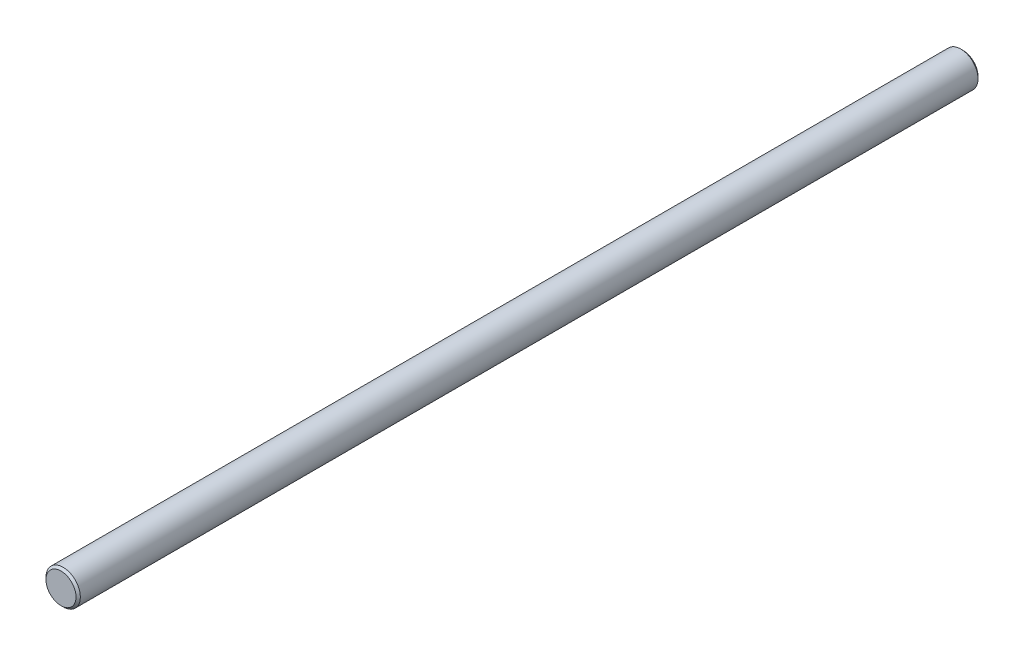
ISO-10303-21;
HEADER;
FILE_DESCRIPTION(('STEP AP214'),'2;1');
FILE_NAME('part.step','',(''),(''),'','','');
FILE_SCHEMA(('AUTOMOTIVE_DESIGN { 1 0 10303 214 1 1 1 1 }'));
ENDSEC;
DATA;
#1=APPLICATION_CONTEXT('core data for automotive mechanical design processes');
#2=APPLICATION_PROTOCOL_DEFINITION('international standard','automotive_design',2000,#1);
#3=PRODUCT_CONTEXT('',#1,'mechanical');
#4=PRODUCT('Part','Part','',(#3));
#5=PRODUCT_RELATED_PRODUCT_CATEGORY('part','',(#4));
#6=PRODUCT_DEFINITION_FORMATION('','',#4);
#7=PRODUCT_DEFINITION_CONTEXT('part definition',#1,'design');
#8=PRODUCT_DEFINITION('design','',#6,#7);
#9=PRODUCT_DEFINITION_SHAPE('','',#8);
#10=(LENGTH_UNIT() NAMED_UNIT(*) SI_UNIT(.MILLI.,.METRE.));
#11=(NAMED_UNIT(*) PLANE_ANGLE_UNIT() SI_UNIT($,.RADIAN.));
#12=(NAMED_UNIT(*) SI_UNIT($,.STERADIAN.) SOLID_ANGLE_UNIT());
#13=UNCERTAINTY_MEASURE_WITH_UNIT(LENGTH_MEASURE(1.E-05),#10,'distance_accuracy_value','');
#14=(GEOMETRIC_REPRESENTATION_CONTEXT(3) GLOBAL_UNCERTAINTY_ASSIGNED_CONTEXT((#13)) GLOBAL_UNIT_ASSIGNED_CONTEXT((#10,
#11,#12)) REPRESENTATION_CONTEXT('',''));
#15=CARTESIAN_POINT('',(0.,0.,0.));
#16=DIRECTION('',(0.,0.,1.));
#17=DIRECTION('',(1.,0.,0.));
#18=AXIS2_PLACEMENT_3D('',#15,#16,#17);
#19=CARTESIAN_POINT('',(0.,0.,210.));
#20=DIRECTION('',(0.,0.,-1.));
#21=DIRECTION('',(-1.,0.,0.));
#22=AXIS2_PLACEMENT_3D('',#19,#20,#21);
#23=CYLINDRICAL_SURFACE('',#22,8.);
#24=CARTESIAN_POINT('',(0.,0.,-209.));
#25=DIRECTION('',(0.,0.,1.));
#26=DIRECTION('',(1.,0.,0.));
#27=AXIS2_PLACEMENT_3D('',#24,#25,#26);
#28=CIRCLE('',#27,8.);
#29=CARTESIAN_POINT('',(8.,0.,-209.));
#30=VERTEX_POINT('',#29);
#31=EDGE_CURVE('E42',#30,#30,#28,.T.);
#32=ORIENTED_EDGE('',*,*,#31,.T.);
#33=EDGE_LOOP('',(#32));
#34=FACE_BOUND('',#33,.T.);
#35=CARTESIAN_POINT('',(0.,0.,209.));
#36=DIRECTION('',(0.,0.,1.));
#37=DIRECTION('',(1.,0.,0.));
#38=AXIS2_PLACEMENT_3D('',#35,#36,#37);
#39=CIRCLE('',#38,8.);
#40=CARTESIAN_POINT('',(8.,0.,209.));
#41=VERTEX_POINT('',#40);
#42=EDGE_CURVE('E46',#41,#41,#39,.F.);
#43=ORIENTED_EDGE('',*,*,#42,.T.);
#44=EDGE_LOOP('',(#43));
#45=FACE_BOUND('',#44,.T.);
#46=ADVANCED_FACE('F31',(#34,#45),#23,.T.);
#47=CARTESIAN_POINT('',(0.,0.,210.));
#48=DIRECTION('',(0.,0.,1.));
#49=DIRECTION('',(1.,0.,0.));
#50=AXIS2_PLACEMENT_3D('',#47,#48,#49);
#51=PLANE('',#50);
#52=CARTESIAN_POINT('',(0.,0.,210.));
#53=DIRECTION('',(0.,0.,1.));
#54=DIRECTION('',(1.,0.,0.));
#55=AXIS2_PLACEMENT_3D('',#52,#53,#54);
#56=CIRCLE('',#55,7.00000000000001);
#57=CARTESIAN_POINT('',(7.00000000000001,0.,210.));
#58=VERTEX_POINT('',#57);
#59=EDGE_CURVE('E10',#58,#58,#56,.T.);
#60=ORIENTED_EDGE('',*,*,#59,.T.);
#61=EDGE_LOOP('',(#60));
#62=FACE_BOUND('',#61,.T.);
#63=ADVANCED_FACE('F62',(#62),#51,.T.);
#64=CARTESIAN_POINT('',(0.,0.,-210.));
#65=DIRECTION('',(0.,0.,1.));
#66=DIRECTION('',(1.,0.,0.));
#67=AXIS2_PLACEMENT_3D('',#64,#65,#66);
#68=PLANE('',#67);
#69=CARTESIAN_POINT('',(0.,0.,-210.));
#70=DIRECTION('',(0.,0.,1.));
#71=DIRECTION('',(1.,0.,0.));
#72=AXIS2_PLACEMENT_3D('',#69,#70,#71);
#73=CIRCLE('',#72,7.00000000000001);
#74=CARTESIAN_POINT('',(7.00000000000001,0.,-210.));
#75=VERTEX_POINT('',#74);
#76=EDGE_CURVE('E38',#75,#75,#73,.F.);
#77=ORIENTED_EDGE('',*,*,#76,.T.);
#78=EDGE_LOOP('',(#77));
#79=FACE_BOUND('',#78,.T.);
#80=ADVANCED_FACE('F59',(#79),#68,.F.);
#81=CARTESIAN_POINT('',(0.,0.,-209.));
#82=DIRECTION('',(0.,0.,1.));
#83=DIRECTION('',(1.,0.,0.));
#84=AXIS2_PLACEMENT_3D('',#81,#82,#83);
#85=CONICAL_SURFACE('',#84,8.,0.785398163397417);
#86=ORIENTED_EDGE('',*,*,#76,.F.);
#87=EDGE_LOOP('',(#86));
#88=FACE_BOUND('',#87,.T.);
#89=ORIENTED_EDGE('',*,*,#31,.F.);
#90=EDGE_LOOP('',(#89));
#91=FACE_BOUND('',#90,.T.);
#92=ADVANCED_FACE('F55',(#88,#91),#85,.T.);
#93=CARTESIAN_POINT('',(0.,0.,210.));
#94=DIRECTION('',(0.,0.,-1.));
#95=DIRECTION('',(-1.,0.,0.));
#96=AXIS2_PLACEMENT_3D('',#93,#94,#95);
#97=CONICAL_SURFACE('',#96,7.00000000000001,0.785398163397459);
#98=ORIENTED_EDGE('',*,*,#42,.F.);
#99=EDGE_LOOP('',(#98));
#100=FACE_BOUND('',#99,.T.);
#101=ORIENTED_EDGE('',*,*,#59,.F.);
#102=EDGE_LOOP('',(#101));
#103=FACE_BOUND('',#102,.T.);
#104=ADVANCED_FACE('F33',(#100,#103),#97,.T.);
#105=CLOSED_SHELL('',(#46,#63,#80,#92,#104));
#106=MANIFOLD_SOLID_BREP('B2',#105);
#107=ADVANCED_BREP_SHAPE_REPRESENTATION('',(#18,#106),#14);
#108=SHAPE_DEFINITION_REPRESENTATION(#9,#107);
ENDSEC;
END-ISO-10303-21;
